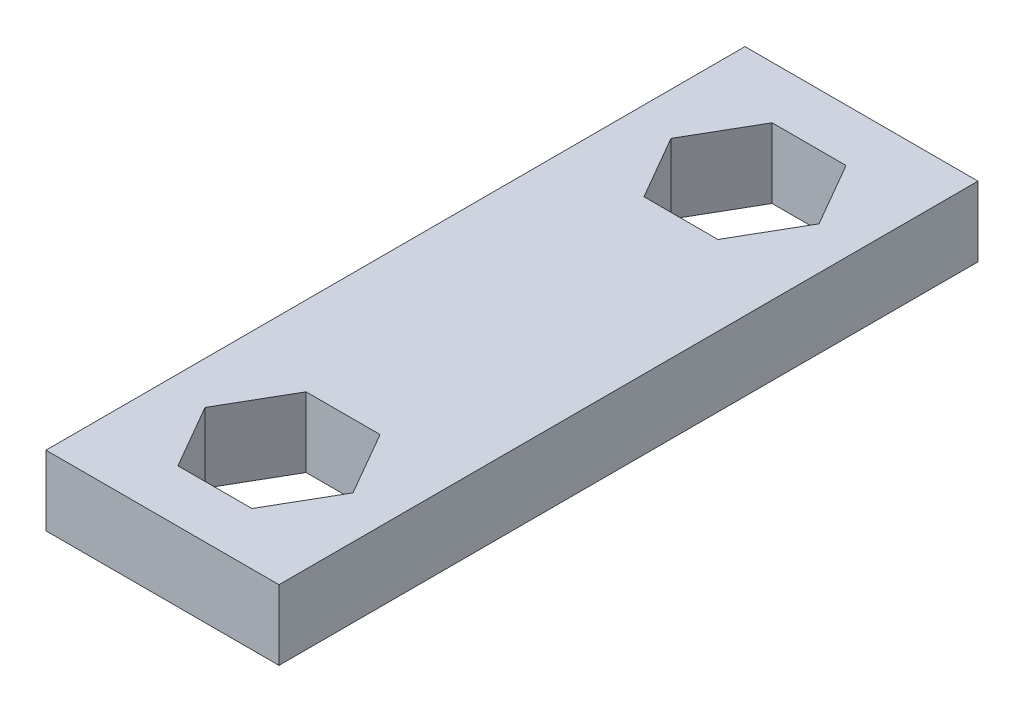
ISO-10303-21;
HEADER;
FILE_DESCRIPTION(('STEP AP214'),'2;1');
FILE_NAME('part.step','',(''),(''),'','','');
FILE_SCHEMA(('AUTOMOTIVE_DESIGN { 1 0 10303 214 1 1 1 1 }'));
ENDSEC;
DATA;
#1=APPLICATION_CONTEXT('core data for automotive mechanical design processes');
#2=APPLICATION_PROTOCOL_DEFINITION('international standard','automotive_design',2000,#1);
#3=PRODUCT_CONTEXT('',#1,'mechanical');
#4=PRODUCT('Part','Part','',(#3));
#5=PRODUCT_RELATED_PRODUCT_CATEGORY('part','',(#4));
#6=PRODUCT_DEFINITION_FORMATION('','',#4);
#7=PRODUCT_DEFINITION_CONTEXT('part definition',#1,'design');
#8=PRODUCT_DEFINITION('design','',#6,#7);
#9=PRODUCT_DEFINITION_SHAPE('','',#8);
#10=(LENGTH_UNIT() NAMED_UNIT(*) SI_UNIT(.MILLI.,.METRE.));
#11=(NAMED_UNIT(*) PLANE_ANGLE_UNIT() SI_UNIT($,.RADIAN.));
#12=(NAMED_UNIT(*) SI_UNIT($,.STERADIAN.) SOLID_ANGLE_UNIT());
#13=UNCERTAINTY_MEASURE_WITH_UNIT(LENGTH_MEASURE(1.E-05),#10,'distance_accuracy_value','');
#14=(GEOMETRIC_REPRESENTATION_CONTEXT(3) GLOBAL_UNCERTAINTY_ASSIGNED_CONTEXT((#13)) GLOBAL_UNIT_ASSIGNED_CONTEXT((#10,
#11,#12)) REPRESENTATION_CONTEXT('',''));
#15=CARTESIAN_POINT('',(0.,0.,0.));
#16=DIRECTION('',(0.,0.,1.));
#17=DIRECTION('',(1.,0.,0.));
#18=AXIS2_PLACEMENT_3D('',#15,#16,#17);
#19=CARTESIAN_POINT('',(-0.796633369868302,3.,-0.459936490538903));
#20=DIRECTION('',(-0.866025403784439,0.,-0.5));
#21=DIRECTION('',(-0.5,0.,0.866025403784439));
#22=AXIS2_PLACEMENT_3D('',#19,#20,#21);
#23=PLANE('',#22);
#24=DIRECTION('',(0.5,0.,-0.866025403784439));
#25=VECTOR('',#24,1.);
#26=CARTESIAN_POINT('',(-0.796633369868302,0.,-0.459936490538903));
#27=LINE('',#26,#25);
#28=CARTESIAN_POINT('',(1.82457351945706,0.,-5.));
#29=VERTEX_POINT('',#28);
#30=CARTESIAN_POINT('',(3.41228675972853,0.,-7.75));
#31=VERTEX_POINT('',#30);
#32=EDGE_CURVE('E232',#29,#31,#27,.T.);
#33=ORIENTED_EDGE('',*,*,#32,.T.);
#34=DIRECTION('',(0.,-1.,0.));
#35=VECTOR('',#34,1.);
#36=CARTESIAN_POINT('',(3.41228675972853,3.,-7.75));
#37=LINE('',#36,#35);
#38=CARTESIAN_POINT('',(3.41228675972853,3.,-7.75));
#39=VERTEX_POINT('',#38);
#40=EDGE_CURVE('E11',#39,#31,#37,.T.);
#41=ORIENTED_EDGE('',*,*,#40,.F.);
#42=DIRECTION('',(0.5,0.,-0.866025403784439));
#43=VECTOR('',#42,1.);
#44=CARTESIAN_POINT('',(-0.796633369868302,3.,-0.459936490538903));
#45=LINE('',#44,#43);
#46=CARTESIAN_POINT('',(1.82457351945706,3.,-5.));
#47=VERTEX_POINT('',#46);
#48=EDGE_CURVE('E339',#47,#39,#45,.T.);
#49=ORIENTED_EDGE('',*,*,#48,.F.);
#50=DIRECTION('',(0.,-1.,0.));
#51=VECTOR('',#50,1.);
#52=CARTESIAN_POINT('',(1.82457351945706,3.,-5.));
#53=LINE('',#52,#51);
#54=EDGE_CURVE('E249',#47,#29,#53,.T.);
#55=ORIENTED_EDGE('',*,*,#54,.T.);
#56=EDGE_LOOP('',(#33,#41,#49,#55));
#57=FACE_BOUND('',#56,.T.);
#58=ADVANCED_FACE('F39',(#57),#23,.F.);
#59=CARTESIAN_POINT('',(0.,3.,-7.75));
#60=DIRECTION('',(0.,0.,-1.));
#61=DIRECTION('',(-1.,0.,0.));
#62=AXIS2_PLACEMENT_3D('',#59,#60,#61);
#63=PLANE('',#62);
#64=DIRECTION('',(1.,0.,0.));
#65=VECTOR('',#64,1.);
#66=CARTESIAN_POINT('',(0.,0.,-7.75));
#67=LINE('',#66,#65);
#68=CARTESIAN_POINT('',(6.58771324027147,0.,-7.75));
#69=VERTEX_POINT('',#68);
#70=EDGE_CURVE('E236',#31,#69,#67,.T.);
#71=ORIENTED_EDGE('',*,*,#70,.T.);
#72=DIRECTION('',(0.,-1.,0.));
#73=VECTOR('',#72,1.);
#74=CARTESIAN_POINT('',(6.58771324027147,3.,-7.75));
#75=LINE('',#74,#73);
#76=CARTESIAN_POINT('',(6.58771324027147,3.,-7.75));
#77=VERTEX_POINT('',#76);
#78=EDGE_CURVE('E50',#77,#69,#75,.T.);
#79=ORIENTED_EDGE('',*,*,#78,.F.);
#80=DIRECTION('',(1.,0.,0.));
#81=VECTOR('',#80,1.);
#82=CARTESIAN_POINT('',(0.,3.,-7.75));
#83=LINE('',#82,#81);
#84=EDGE_CURVE('E342',#39,#77,#83,.T.);
#85=ORIENTED_EDGE('',*,*,#84,.F.);
#86=ORIENTED_EDGE('',*,*,#40,.T.);
#87=EDGE_LOOP('',(#71,#79,#85,#86));
#88=FACE_BOUND('',#87,.T.);
#89=ADVANCED_FACE('F349',(#88),#63,.F.);
#90=CARTESIAN_POINT('',(8.2966333698683,3.,-4.7900635094611));
#91=DIRECTION('',(0.866025403784439,0.,-0.5));
#92=DIRECTION('',(-0.5,0.,-0.866025403784439));
#93=AXIS2_PLACEMENT_3D('',#90,#91,#92);
#94=PLANE('',#93);
#95=DIRECTION('',(0.5,0.,0.866025403784439));
#96=VECTOR('',#95,1.);
#97=CARTESIAN_POINT('',(8.2966333698683,0.,-4.7900635094611));
#98=LINE('',#97,#96);
#99=CARTESIAN_POINT('',(8.17542648054294,0.,-4.99999999999999));
#100=VERTEX_POINT('',#99);
#101=EDGE_CURVE('E239',#69,#100,#98,.T.);
#102=ORIENTED_EDGE('',*,*,#101,.T.);
#103=DIRECTION('',(0.,-1.,0.));
#104=VECTOR('',#103,1.);
#105=CARTESIAN_POINT('',(8.17542648054294,3.,-4.99999999999999));
#106=LINE('',#105,#104);
#107=CARTESIAN_POINT('',(8.17542648054294,3.,-4.99999999999999));
#108=VERTEX_POINT('',#107);
#109=EDGE_CURVE('E181',#108,#100,#106,.T.);
#110=ORIENTED_EDGE('',*,*,#109,.F.);
#111=DIRECTION('',(0.5,0.,0.866025403784439));
#112=VECTOR('',#111,1.);
#113=CARTESIAN_POINT('',(8.2966333698683,3.,-4.7900635094611));
#114=LINE('',#113,#112);
#115=EDGE_CURVE('E170',#77,#108,#114,.T.);
#116=ORIENTED_EDGE('',*,*,#115,.F.);
#117=ORIENTED_EDGE('',*,*,#78,.T.);
#118=EDGE_LOOP('',(#102,#110,#116,#117));
#119=FACE_BOUND('',#118,.T.);
#120=ADVANCED_FACE('F352',(#119),#94,.F.);
#121=CARTESIAN_POINT('',(3.96650635094612,3.,2.2900635094611));
#122=DIRECTION('',(0.866025403784439,0.,0.5));
#123=DIRECTION('',(0.5,0.,-0.866025403784439));
#124=AXIS2_PLACEMENT_3D('',#121,#122,#123);
#125=PLANE('',#124);
#126=DIRECTION('',(-0.5,0.,0.866025403784439));
#127=VECTOR('',#126,1.);
#128=CARTESIAN_POINT('',(3.96650635094612,0.,2.2900635094611));
#129=LINE('',#128,#127);
#130=CARTESIAN_POINT('',(6.58771324027147,0.,-2.25));
#131=VERTEX_POINT('',#130);
#132=EDGE_CURVE('E179',#100,#131,#129,.T.);
#133=ORIENTED_EDGE('',*,*,#132,.T.);
#134=DIRECTION('',(0.,-1.,0.));
#135=VECTOR('',#134,1.);
#136=CARTESIAN_POINT('',(6.58771324027147,3.,-2.25));
#137=LINE('',#136,#135);
#138=CARTESIAN_POINT('',(6.58771324027147,3.,-2.25));
#139=VERTEX_POINT('',#138);
#140=EDGE_CURVE('E176',#139,#131,#137,.T.);
#141=ORIENTED_EDGE('',*,*,#140,.F.);
#142=DIRECTION('',(-0.5,0.,0.866025403784439));
#143=VECTOR('',#142,1.);
#144=CARTESIAN_POINT('',(3.96650635094612,3.,2.2900635094611));
#145=LINE('',#144,#143);
#146=EDGE_CURVE('E164',#108,#139,#145,.T.);
#147=ORIENTED_EDGE('',*,*,#146,.F.);
#148=ORIENTED_EDGE('',*,*,#109,.T.);
#149=EDGE_LOOP('',(#133,#141,#147,#148));
#150=FACE_BOUND('',#149,.T.);
#151=ADVANCED_FACE('F177',(#150),#125,.F.);
#152=CARTESIAN_POINT('',(0.,3.,-2.25));
#153=DIRECTION('',(0.,0.,1.));
#154=DIRECTION('',(1.,0.,0.));
#155=AXIS2_PLACEMENT_3D('',#152,#153,#154);
#156=PLANE('',#155);
#157=DIRECTION('',(-1.,0.,0.));
#158=VECTOR('',#157,1.);
#159=CARTESIAN_POINT('',(0.,0.,-2.25));
#160=LINE('',#159,#158);
#161=CARTESIAN_POINT('',(3.41228675972853,0.,-2.25));
#162=VERTEX_POINT('',#161);
#163=EDGE_CURVE('E112',#131,#162,#160,.T.);
#164=ORIENTED_EDGE('',*,*,#163,.T.);
#165=DIRECTION('',(0.,-1.,0.));
#166=VECTOR('',#165,1.);
#167=CARTESIAN_POINT('',(3.41228675972853,3.,-2.25));
#168=LINE('',#167,#166);
#169=CARTESIAN_POINT('',(3.41228675972853,3.,-2.25));
#170=VERTEX_POINT('',#169);
#171=EDGE_CURVE('E182',#170,#162,#168,.T.);
#172=ORIENTED_EDGE('',*,*,#171,.F.);
#173=DIRECTION('',(-1.,0.,0.));
#174=VECTOR('',#173,1.);
#175=CARTESIAN_POINT('',(0.,3.,-2.25));
#176=LINE('',#175,#174);
#177=EDGE_CURVE('E168',#139,#170,#176,.T.);
#178=ORIENTED_EDGE('',*,*,#177,.F.);
#179=ORIENTED_EDGE('',*,*,#140,.T.);
#180=EDGE_LOOP('',(#164,#172,#178,#179));
#181=FACE_BOUND('',#180,.T.);
#182=ADVANCED_FACE('F184',(#181),#156,.F.);
#183=CARTESIAN_POINT('',(0.,3.,0.));
#184=DIRECTION('',(0.,0.,-1.));
#185=DIRECTION('',(-1.,0.,0.));
#186=AXIS2_PLACEMENT_3D('',#183,#184,#185);
#187=PLANE('',#186);
#188=DIRECTION('',(1.,0.,0.));
#189=VECTOR('',#188,1.);
#190=CARTESIAN_POINT('',(0.,0.,0.));
#191=LINE('',#190,#189);
#192=CARTESIAN_POINT('',(0.,0.,0.));
#193=VERTEX_POINT('',#192);
#194=CARTESIAN_POINT('',(10.,0.,0.));
#195=VERTEX_POINT('',#194);
#196=EDGE_CURVE('E216',#193,#195,#191,.T.);
#197=ORIENTED_EDGE('',*,*,#196,.T.);
#198=DIRECTION('',(0.,-1.,0.));
#199=VECTOR('',#198,1.);
#200=CARTESIAN_POINT('',(10.,3.,0.));
#201=LINE('',#200,#199);
#202=CARTESIAN_POINT('',(10.,3.,0.));
#203=VERTEX_POINT('',#202);
#204=EDGE_CURVE('E252',#203,#195,#201,.T.);
#205=ORIENTED_EDGE('',*,*,#204,.F.);
#206=DIRECTION('',(1.,0.,0.));
#207=VECTOR('',#206,1.);
#208=CARTESIAN_POINT('',(0.,3.,0.));
#209=LINE('',#208,#207);
#210=CARTESIAN_POINT('',(0.,3.,0.));
#211=VERTEX_POINT('',#210);
#212=EDGE_CURVE('E324',#211,#203,#209,.T.);
#213=ORIENTED_EDGE('',*,*,#212,.F.);
#214=DIRECTION('',(0.,-1.,0.));
#215=VECTOR('',#214,1.);
#216=CARTESIAN_POINT('',(0.,3.,0.));
#217=LINE('',#216,#215);
#218=EDGE_CURVE('E260',#211,#193,#217,.T.);
#219=ORIENTED_EDGE('',*,*,#218,.T.);
#220=EDGE_LOOP('',(#197,#205,#213,#219));
#221=FACE_BOUND('',#220,.T.);
#222=ADVANCED_FACE('F389',(#221),#187,.F.);
#223=CARTESIAN_POINT('',(10.,3.,0.));
#224=DIRECTION('',(-1.,0.,0.));
#225=DIRECTION('',(0.,0.,1.));
#226=AXIS2_PLACEMENT_3D('',#223,#224,#225);
#227=PLANE('',#226);
#228=DIRECTION('',(0.,0.,-1.));
#229=VECTOR('',#228,1.);
#230=CARTESIAN_POINT('',(10.,0.,0.));
#231=LINE('',#230,#229);
#232=CARTESIAN_POINT('',(10.,0.,-30.));
#233=VERTEX_POINT('',#232);
#234=EDGE_CURVE('E220',#195,#233,#231,.T.);
#235=ORIENTED_EDGE('',*,*,#234,.T.);
#236=DIRECTION('',(0.,-1.,0.));
#237=VECTOR('',#236,1.);
#238=CARTESIAN_POINT('',(10.,3.,-30.));
#239=LINE('',#238,#237);
#240=CARTESIAN_POINT('',(10.,3.,-30.));
#241=VERTEX_POINT('',#240);
#242=EDGE_CURVE('E266',#241,#233,#239,.T.);
#243=ORIENTED_EDGE('',*,*,#242,.F.);
#244=DIRECTION('',(0.,0.,-1.));
#245=VECTOR('',#244,1.);
#246=CARTESIAN_POINT('',(10.,3.,0.));
#247=LINE('',#246,#245);
#248=EDGE_CURVE('E328',#203,#241,#247,.T.);
#249=ORIENTED_EDGE('',*,*,#248,.F.);
#250=ORIENTED_EDGE('',*,*,#204,.T.);
#251=EDGE_LOOP('',(#235,#243,#249,#250));
#252=FACE_BOUND('',#251,.T.);
#253=ADVANCED_FACE('F385',(#252),#227,.F.);
#254=CARTESIAN_POINT('',(0.,3.,-30.));
#255=DIRECTION('',(0.,0.,-1.));
#256=DIRECTION('',(-1.,0.,0.));
#257=AXIS2_PLACEMENT_3D('',#254,#255,#256);
#258=PLANE('',#257);
#259=DIRECTION('',(1.,0.,0.));
#260=VECTOR('',#259,1.);
#261=CARTESIAN_POINT('',(0.,0.,-30.));
#262=LINE('',#261,#260);
#263=CARTESIAN_POINT('',(0.,0.,-30.));
#264=VERTEX_POINT('',#263);
#265=EDGE_CURVE('E224',#264,#233,#262,.T.);
#266=ORIENTED_EDGE('',*,*,#265,.F.);
#267=DIRECTION('',(0.,-1.,0.));
#268=VECTOR('',#267,1.);
#269=CARTESIAN_POINT('',(0.,3.,-30.));
#270=LINE('',#269,#268);
#271=CARTESIAN_POINT('',(0.,3.,-30.));
#272=VERTEX_POINT('',#271);
#273=EDGE_CURVE('E263',#272,#264,#270,.T.);
#274=ORIENTED_EDGE('',*,*,#273,.F.);
#275=DIRECTION('',(1.,0.,0.));
#276=VECTOR('',#275,1.);
#277=CARTESIAN_POINT('',(0.,3.,-30.));
#278=LINE('',#277,#276);
#279=EDGE_CURVE('E331',#272,#241,#278,.T.);
#280=ORIENTED_EDGE('',*,*,#279,.T.);
#281=ORIENTED_EDGE('',*,*,#242,.T.);
#282=EDGE_LOOP('',(#266,#274,#280,#281));
#283=FACE_BOUND('',#282,.T.);
#284=ADVANCED_FACE('F382',(#283),#258,.T.);
#285=CARTESIAN_POINT('',(12.1937476868983,3.,-7.04006350946109));
#286=DIRECTION('',(0.866025403784439,0.,-0.5));
#287=DIRECTION('',(-0.5,0.,-0.866025403784439));
#288=AXIS2_PLACEMENT_3D('',#285,#286,#287);
#289=PLANE('',#288);
#290=DIRECTION('',(0.5,0.,0.866025403784439));
#291=VECTOR('',#290,1.);
#292=CARTESIAN_POINT('',(12.1937476868983,0.,-7.04006350946109));
#293=LINE('',#292,#291);
#294=CARTESIAN_POINT('',(1.82457351945705,0.,-25.));
#295=VERTEX_POINT('',#294);
#296=CARTESIAN_POINT('',(3.41228675972853,0.,-22.25));
#297=VERTEX_POINT('',#296);
#298=EDGE_CURVE('E192',#295,#297,#293,.T.);
#299=ORIENTED_EDGE('',*,*,#298,.F.);
#300=DIRECTION('',(0.,-1.,0.));
#301=VECTOR('',#300,1.);
#302=CARTESIAN_POINT('',(1.82457351945705,3.,-25.));
#303=LINE('',#302,#301);
#304=CARTESIAN_POINT('',(1.82457351945705,3.,-25.));
#305=VERTEX_POINT('',#304);
#306=EDGE_CURVE('E43',#305,#295,#303,.T.);
#307=ORIENTED_EDGE('',*,*,#306,.F.);
#308=DIRECTION('',(0.5,0.,0.866025403784439));
#309=VECTOR('',#308,1.);
#310=CARTESIAN_POINT('',(12.1937476868983,3.,-7.04006350946109));
#311=LINE('',#310,#309);
#312=CARTESIAN_POINT('',(3.41228675972853,3.,-22.25));
#313=VERTEX_POINT('',#312);
#314=EDGE_CURVE('E248',#305,#313,#311,.T.);
#315=ORIENTED_EDGE('',*,*,#314,.T.);
#316=DIRECTION('',(0.,-1.,0.));
#317=VECTOR('',#316,1.);
#318=CARTESIAN_POINT('',(3.41228675972853,3.,-22.25));
#319=LINE('',#318,#317);
#320=EDGE_CURVE('E188',#313,#297,#319,.T.);
#321=ORIENTED_EDGE('',*,*,#320,.T.);
#322=EDGE_LOOP('',(#299,#307,#315,#321));
#323=FACE_BOUND('',#322,.T.);
#324=ADVANCED_FACE('F41',(#323),#289,.T.);
#325=CARTESIAN_POINT('',(-9.4568874077127,3.,-5.45993649053891));
#326=DIRECTION('',(0.866025403784438,0.,0.5));
#327=DIRECTION('',(0.5,0.,-0.866025403784439));
#328=AXIS2_PLACEMENT_3D('',#325,#326,#327);
#329=PLANE('',#328);
#330=DIRECTION('',(-0.5,0.,0.866025403784439));
#331=VECTOR('',#330,1.);
#332=CARTESIAN_POINT('',(-9.4568874077127,0.,-5.45993649053891));
#333=LINE('',#332,#331);
#334=CARTESIAN_POINT('',(3.41228675972853,0.,-27.75));
#335=VERTEX_POINT('',#334);
#336=EDGE_CURVE('E196',#335,#295,#333,.T.);
#337=ORIENTED_EDGE('',*,*,#336,.F.);
#338=DIRECTION('',(0.,-1.,0.));
#339=VECTOR('',#338,1.);
#340=CARTESIAN_POINT('',(3.41228675972853,3.,-27.75));
#341=LINE('',#340,#339);
#342=CARTESIAN_POINT('',(3.41228675972853,3.,-27.75));
#343=VERTEX_POINT('',#342);
#344=EDGE_CURVE('E282',#343,#335,#341,.T.);
#345=ORIENTED_EDGE('',*,*,#344,.F.);
#346=DIRECTION('',(-0.5,0.,0.866025403784439));
#347=VECTOR('',#346,1.);
#348=CARTESIAN_POINT('',(-9.4568874077127,3.,-5.45993649053891));
#349=LINE('',#348,#347);
#350=EDGE_CURVE('E293',#343,#305,#349,.T.);
#351=ORIENTED_EDGE('',*,*,#350,.T.);
#352=ORIENTED_EDGE('',*,*,#306,.T.);
#353=EDGE_LOOP('',(#337,#345,#351,#352));
#354=FACE_BOUND('',#353,.T.);
#355=ADVANCED_FACE('F291',(#354),#329,.T.);
#356=CARTESIAN_POINT('',(0.,3.,-27.75));
#357=DIRECTION('',(0.,0.,1.));
#358=DIRECTION('',(1.,0.,0.));
#359=AXIS2_PLACEMENT_3D('',#356,#357,#358);
#360=PLANE('',#359);
#361=DIRECTION('',(-1.,0.,0.));
#362=VECTOR('',#361,1.);
#363=CARTESIAN_POINT('',(0.,0.,-27.75));
#364=LINE('',#363,#362);
#365=CARTESIAN_POINT('',(6.58771324027147,0.,-27.75));
#366=VERTEX_POINT('',#365);
#367=EDGE_CURVE('E200',#366,#335,#364,.T.);
#368=ORIENTED_EDGE('',*,*,#367,.F.);
#369=DIRECTION('',(0.,-1.,0.));
#370=VECTOR('',#369,1.);
#371=CARTESIAN_POINT('',(6.58771324027147,3.,-27.75));
#372=LINE('',#371,#370);
#373=CARTESIAN_POINT('',(6.58771324027147,3.,-27.75));
#374=VERTEX_POINT('',#373);
#375=EDGE_CURVE('E280',#374,#366,#372,.T.);
#376=ORIENTED_EDGE('',*,*,#375,.F.);
#377=DIRECTION('',(-1.,0.,0.));
#378=VECTOR('',#377,1.);
#379=CARTESIAN_POINT('',(0.,3.,-27.75));
#380=LINE('',#379,#378);
#381=EDGE_CURVE('E301',#374,#343,#380,.T.);
#382=ORIENTED_EDGE('',*,*,#381,.T.);
#383=ORIENTED_EDGE('',*,*,#344,.T.);
#384=EDGE_LOOP('',(#368,#376,#382,#383));
#385=FACE_BOUND('',#384,.T.);
#386=ADVANCED_FACE('F299',(#385),#360,.T.);
#387=CARTESIAN_POINT('',(16.9568874077127,3.,-9.79006350946109));
#388=DIRECTION('',(-0.866025403784439,0.,0.5));
#389=DIRECTION('',(0.5,0.,0.866025403784439));
#390=AXIS2_PLACEMENT_3D('',#387,#388,#389);
#391=PLANE('',#390);
#392=DIRECTION('',(-0.5,0.,-0.866025403784439));
#393=VECTOR('',#392,1.);
#394=CARTESIAN_POINT('',(16.9568874077127,0.,-9.79006350946109));
#395=LINE('',#394,#393);
#396=CARTESIAN_POINT('',(8.17542648054295,0.,-25.));
#397=VERTEX_POINT('',#396);
#398=EDGE_CURVE('E204',#397,#366,#395,.T.);
#399=ORIENTED_EDGE('',*,*,#398,.F.);
#400=DIRECTION('',(0.,-1.,0.));
#401=VECTOR('',#400,1.);
#402=CARTESIAN_POINT('',(8.17542648054295,3.,-25.));
#403=LINE('',#402,#401);
#404=CARTESIAN_POINT('',(8.17542648054295,3.,-25.));
#405=VERTEX_POINT('',#404);
#406=EDGE_CURVE('E277',#405,#397,#403,.T.);
#407=ORIENTED_EDGE('',*,*,#406,.F.);
#408=DIRECTION('',(-0.5,0.,-0.866025403784439));
#409=VECTOR('',#408,1.);
#410=CARTESIAN_POINT('',(16.9568874077127,3.,-9.79006350946109));
#411=LINE('',#410,#409);
#412=EDGE_CURVE('E308',#405,#374,#411,.T.);
#413=ORIENTED_EDGE('',*,*,#412,.T.);
#414=ORIENTED_EDGE('',*,*,#375,.T.);
#415=EDGE_LOOP('',(#399,#407,#413,#414));
#416=FACE_BOUND('',#415,.T.);
#417=ADVANCED_FACE('F312',(#416),#391,.T.);
#418=CARTESIAN_POINT('',(-4.69374768689828,3.,-2.70993649053891));
#419=DIRECTION('',(-0.866025403784439,0.,-0.5));
#420=DIRECTION('',(-0.5,0.,0.866025403784439));
#421=AXIS2_PLACEMENT_3D('',#418,#419,#420);
#422=PLANE('',#421);
#423=DIRECTION('',(0.5,0.,-0.866025403784439));
#424=VECTOR('',#423,1.);
#425=CARTESIAN_POINT('',(-4.69374768689828,0.,-2.70993649053891));
#426=LINE('',#425,#424);
#427=CARTESIAN_POINT('',(6.58771324027147,0.,-22.25));
#428=VERTEX_POINT('',#427);
#429=EDGE_CURVE('E208',#428,#397,#426,.T.);
#430=ORIENTED_EDGE('',*,*,#429,.F.);
#431=DIRECTION('',(0.,-1.,0.));
#432=VECTOR('',#431,1.);
#433=CARTESIAN_POINT('',(6.58771324027147,3.,-22.25));
#434=LINE('',#433,#432);
#435=CARTESIAN_POINT('',(6.58771324027147,3.,-22.25));
#436=VERTEX_POINT('',#435);
#437=EDGE_CURVE('E274',#436,#428,#434,.T.);
#438=ORIENTED_EDGE('',*,*,#437,.F.);
#439=DIRECTION('',(0.5,0.,-0.866025403784439));
#440=VECTOR('',#439,1.);
#441=CARTESIAN_POINT('',(-4.69374768689828,3.,-2.70993649053891));
#442=LINE('',#441,#440);
#443=EDGE_CURVE('E314',#436,#405,#442,.T.);
#444=ORIENTED_EDGE('',*,*,#443,.T.);
#445=ORIENTED_EDGE('',*,*,#406,.T.);
#446=EDGE_LOOP('',(#430,#438,#444,#445));
#447=FACE_BOUND('',#446,.T.);
#448=ADVANCED_FACE('F380',(#447),#422,.T.);
#449=CARTESIAN_POINT('',(0.,3.,0.));
#450=DIRECTION('',(-1.,0.,0.));
#451=DIRECTION('',(0.,0.,1.));
#452=AXIS2_PLACEMENT_3D('',#449,#450,#451);
#453=PLANE('',#452);
#454=DIRECTION('',(0.,0.,-1.));
#455=VECTOR('',#454,1.);
#456=CARTESIAN_POINT('',(0.,0.,0.));
#457=LINE('',#456,#455);
#458=EDGE_CURVE('E228',#193,#264,#457,.T.);
#459=ORIENTED_EDGE('',*,*,#458,.F.);
#460=ORIENTED_EDGE('',*,*,#218,.F.);
#461=DIRECTION('',(0.,0.,-1.));
#462=VECTOR('',#461,1.);
#463=CARTESIAN_POINT('',(0.,3.,0.));
#464=LINE('',#463,#462);
#465=EDGE_CURVE('E335',#211,#272,#464,.T.);
#466=ORIENTED_EDGE('',*,*,#465,.T.);
#467=ORIENTED_EDGE('',*,*,#273,.T.);
#468=EDGE_LOOP('',(#459,#460,#466,#467));
#469=FACE_BOUND('',#468,.T.);
#470=ADVANCED_FACE('F365',(#469),#453,.T.);
#471=CARTESIAN_POINT('',(0.,3.,-22.25));
#472=DIRECTION('',(0.,0.,-1.));
#473=DIRECTION('',(-1.,0.,0.));
#474=AXIS2_PLACEMENT_3D('',#471,#472,#473);
#475=PLANE('',#474);
#476=DIRECTION('',(1.,0.,0.));
#477=VECTOR('',#476,1.);
#478=CARTESIAN_POINT('',(0.,0.,-22.25));
#479=LINE('',#478,#477);
#480=EDGE_CURVE('E212',#297,#428,#479,.T.);
#481=ORIENTED_EDGE('',*,*,#480,.F.);
#482=ORIENTED_EDGE('',*,*,#320,.F.);
#483=DIRECTION('',(1.,0.,0.));
#484=VECTOR('',#483,1.);
#485=CARTESIAN_POINT('',(0.,3.,-22.25));
#486=LINE('',#485,#484);
#487=EDGE_CURVE('E317',#313,#436,#486,.T.);
#488=ORIENTED_EDGE('',*,*,#487,.T.);
#489=ORIENTED_EDGE('',*,*,#437,.T.);
#490=EDGE_LOOP('',(#481,#482,#488,#489));
#491=FACE_BOUND('',#490,.T.);
#492=ADVANCED_FACE('F358',(#491),#475,.T.);
#493=CARTESIAN_POINT('',(3.53349364905389,3.,-2.0400635094611));
#494=DIRECTION('',(-0.866025403784438,0.,0.5));
#495=DIRECTION('',(0.5,0.,0.866025403784439));
#496=AXIS2_PLACEMENT_3D('',#493,#494,#495);
#497=PLANE('',#496);
#498=DIRECTION('',(-0.5,0.,-0.866025403784439));
#499=VECTOR('',#498,1.);
#500=CARTESIAN_POINT('',(3.53349364905389,0.,-2.0400635094611));
#501=LINE('',#500,#499);
#502=EDGE_CURVE('E118',#162,#29,#501,.T.);
#503=ORIENTED_EDGE('',*,*,#502,.T.);
#504=ORIENTED_EDGE('',*,*,#54,.F.);
#505=DIRECTION('',(-0.5,0.,-0.866025403784439));
#506=VECTOR('',#505,1.);
#507=CARTESIAN_POINT('',(3.53349364905389,3.,-2.0400635094611));
#508=LINE('',#507,#506);
#509=EDGE_CURVE('E59',#170,#47,#508,.T.);
#510=ORIENTED_EDGE('',*,*,#509,.F.);
#511=ORIENTED_EDGE('',*,*,#171,.T.);
#512=EDGE_LOOP('',(#503,#504,#510,#511));
#513=FACE_BOUND('',#512,.T.);
#514=ADVANCED_FACE('F356',(#513),#497,.F.);
#515=CARTESIAN_POINT('',(0.,3.,0.));
#516=DIRECTION('',(0.,1.,0.));
#517=DIRECTION('',(0.,0.,1.));
#518=AXIS2_PLACEMENT_3D('',#515,#516,#517);
#519=PLANE('',#518);
#520=ORIENTED_EDGE('',*,*,#314,.F.);
#521=ORIENTED_EDGE('',*,*,#350,.F.);
#522=ORIENTED_EDGE('',*,*,#381,.F.);
#523=ORIENTED_EDGE('',*,*,#412,.F.);
#524=ORIENTED_EDGE('',*,*,#443,.F.);
#525=ORIENTED_EDGE('',*,*,#487,.F.);
#526=EDGE_LOOP('',(#520,#521,#522,#523,#524,#525));
#527=FACE_BOUND('',#526,.T.);
#528=ORIENTED_EDGE('',*,*,#212,.T.);
#529=ORIENTED_EDGE('',*,*,#248,.T.);
#530=ORIENTED_EDGE('',*,*,#279,.F.);
#531=ORIENTED_EDGE('',*,*,#465,.F.);
#532=EDGE_LOOP('',(#528,#529,#530,#531));
#533=FACE_BOUND('',#532,.T.);
#534=ORIENTED_EDGE('',*,*,#48,.T.);
#535=ORIENTED_EDGE('',*,*,#84,.T.);
#536=ORIENTED_EDGE('',*,*,#115,.T.);
#537=ORIENTED_EDGE('',*,*,#146,.T.);
#538=ORIENTED_EDGE('',*,*,#177,.T.);
#539=ORIENTED_EDGE('',*,*,#509,.T.);
#540=EDGE_LOOP('',(#534,#535,#536,#537,#538,#539));
#541=FACE_BOUND('',#540,.T.);
#542=ADVANCED_FACE('F166',(#527,#533,#541),#519,.T.);
#543=CARTESIAN_POINT('',(0.,0.,0.));
#544=DIRECTION('',(0.,1.,0.));
#545=DIRECTION('',(0.,0.,1.));
#546=AXIS2_PLACEMENT_3D('',#543,#544,#545);
#547=PLANE('',#546);
#548=ORIENTED_EDGE('',*,*,#298,.T.);
#549=ORIENTED_EDGE('',*,*,#480,.T.);
#550=ORIENTED_EDGE('',*,*,#429,.T.);
#551=ORIENTED_EDGE('',*,*,#398,.T.);
#552=ORIENTED_EDGE('',*,*,#367,.T.);
#553=ORIENTED_EDGE('',*,*,#336,.T.);
#554=EDGE_LOOP('',(#548,#549,#550,#551,#552,#553));
#555=FACE_BOUND('',#554,.T.);
#556=ORIENTED_EDGE('',*,*,#196,.F.);
#557=ORIENTED_EDGE('',*,*,#458,.T.);
#558=ORIENTED_EDGE('',*,*,#265,.T.);
#559=ORIENTED_EDGE('',*,*,#234,.F.);
#560=EDGE_LOOP('',(#556,#557,#558,#559));
#561=FACE_BOUND('',#560,.T.);
#562=ORIENTED_EDGE('',*,*,#32,.F.);
#563=ORIENTED_EDGE('',*,*,#502,.F.);
#564=ORIENTED_EDGE('',*,*,#163,.F.);
#565=ORIENTED_EDGE('',*,*,#132,.F.);
#566=ORIENTED_EDGE('',*,*,#101,.F.);
#567=ORIENTED_EDGE('',*,*,#70,.F.);
#568=EDGE_LOOP('',(#562,#563,#564,#565,#566,#567));
#569=FACE_BOUND('',#568,.T.);
#570=ADVANCED_FACE('F296',(#555,#561,#569),#547,.F.);
#571=CLOSED_SHELL('',(#58,#89,#120,#151,#182,#222,#253,#284,#324,#355,#386,#417,#448,#470,#492,
#514,#542,#570));
#572=MANIFOLD_SOLID_BREP('B2',#571);
#573=ADVANCED_BREP_SHAPE_REPRESENTATION('',(#18,#572),#14);
#574=SHAPE_DEFINITION_REPRESENTATION(#9,#573);
ENDSEC;
END-ISO-10303-21;
